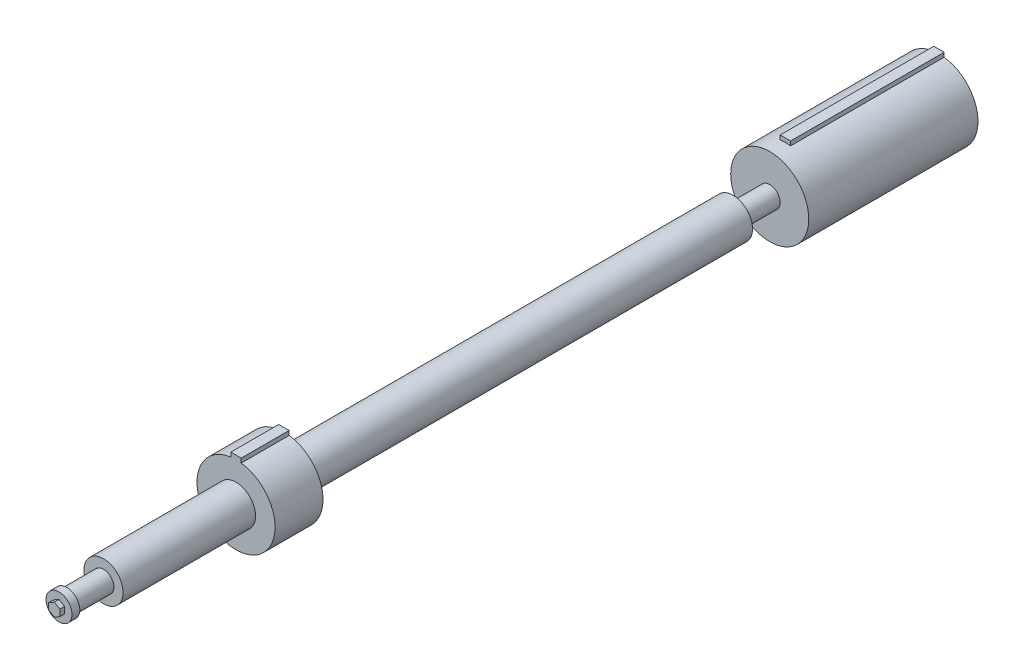
ISO-10303-21;
HEADER;
FILE_DESCRIPTION(('STEP AP214'),'2;1');
FILE_NAME('part.step','',(''),(''),'','','');
FILE_SCHEMA(('AUTOMOTIVE_DESIGN { 1 0 10303 214 1 1 1 1 }'));
ENDSEC;
DATA;
#1=APPLICATION_CONTEXT('core data for automotive mechanical design processes');
#2=APPLICATION_PROTOCOL_DEFINITION('international standard','automotive_design',2000,#1);
#3=PRODUCT_CONTEXT('',#1,'mechanical');
#4=PRODUCT('Part','Part','',(#3));
#5=PRODUCT_RELATED_PRODUCT_CATEGORY('part','',(#4));
#6=PRODUCT_DEFINITION_FORMATION('','',#4);
#7=PRODUCT_DEFINITION_CONTEXT('part definition',#1,'design');
#8=PRODUCT_DEFINITION('design','',#6,#7);
#9=PRODUCT_DEFINITION_SHAPE('','',#8);
#10=(LENGTH_UNIT() NAMED_UNIT(*) SI_UNIT(.MILLI.,.METRE.));
#11=(NAMED_UNIT(*) PLANE_ANGLE_UNIT() SI_UNIT($,.RADIAN.));
#12=(NAMED_UNIT(*) SI_UNIT($,.STERADIAN.) SOLID_ANGLE_UNIT());
#13=UNCERTAINTY_MEASURE_WITH_UNIT(LENGTH_MEASURE(1.E-05),#10,'distance_accuracy_value','');
#14=(GEOMETRIC_REPRESENTATION_CONTEXT(3) GLOBAL_UNCERTAINTY_ASSIGNED_CONTEXT((#13)) GLOBAL_UNIT_ASSIGNED_CONTEXT((#10,
#11,#12)) REPRESENTATION_CONTEXT('',''));
#15=CARTESIAN_POINT('',(0.,0.,0.));
#16=DIRECTION('',(0.,0.,1.));
#17=DIRECTION('',(1.,0.,0.));
#18=AXIS2_PLACEMENT_3D('',#15,#16,#17);
#19=CARTESIAN_POINT('',(0.,0.,120.9));
#20=DIRECTION('',(0.,0.,-1.));
#21=DIRECTION('',(-1.,0.,0.));
#22=AXIS2_PLACEMENT_3D('',#19,#20,#21);
#23=CYLINDRICAL_SURFACE('',#22,7.5);
#24=CARTESIAN_POINT('',(0.,0.,120.9));
#25=DIRECTION('',(0.,0.,1.));
#26=DIRECTION('',(1.,0.,0.));
#27=AXIS2_PLACEMENT_3D('',#24,#25,#26);
#28=CIRCLE('',#27,7.5);
#29=CARTESIAN_POINT('',(7.5,0.,120.9));
#30=VERTEX_POINT('',#29);
#31=EDGE_CURVE('E213',#30,#30,#28,.T.);
#32=ORIENTED_EDGE('',*,*,#31,.F.);
#33=EDGE_LOOP('',(#32));
#34=FACE_BOUND('',#33,.T.);
#35=CARTESIAN_POINT('',(0.,0.,70.));
#36=DIRECTION('',(0.,0.,-1.));
#37=DIRECTION('',(-1.,0.,0.));
#38=AXIS2_PLACEMENT_3D('',#35,#36,#37);
#39=CIRCLE('',#38,7.5);
#40=CARTESIAN_POINT('',(-7.5,0.,70.));
#41=VERTEX_POINT('',#40);
#42=EDGE_CURVE('E11',#41,#41,#39,.T.);
#43=ORIENTED_EDGE('',*,*,#42,.F.);
#44=EDGE_LOOP('',(#43));
#45=FACE_BOUND('',#44,.T.);
#46=ADVANCED_FACE('F35',(#34,#45),#23,.T.);
#47=CARTESIAN_POINT('',(0.,0.,135.));
#48=DIRECTION('',(0.,0.,-1.));
#49=DIRECTION('',(-1.,0.,0.));
#50=AXIS2_PLACEMENT_3D('',#47,#48,#49);
#51=CYLINDRICAL_SURFACE('',#50,4.);
#52=CARTESIAN_POINT('',(0.,0.,120.9));
#53=DIRECTION('',(0.,0.,1.));
#54=DIRECTION('',(1.,0.,0.));
#55=AXIS2_PLACEMENT_3D('',#52,#53,#54);
#56=CIRCLE('',#55,4.);
#57=CARTESIAN_POINT('',(4.,0.,120.9));
#58=VERTEX_POINT('',#57);
#59=EDGE_CURVE('E216',#58,#58,#56,.T.);
#60=ORIENTED_EDGE('',*,*,#59,.T.);
#61=EDGE_LOOP('',(#60));
#62=FACE_BOUND('',#61,.T.);
#63=CARTESIAN_POINT('',(0.,0.,135.));
#64=DIRECTION('',(0.,0.,1.));
#65=DIRECTION('',(1.,0.,0.));
#66=AXIS2_PLACEMENT_3D('',#63,#64,#65);
#67=CIRCLE('',#66,4.);
#68=CARTESIAN_POINT('',(4.,0.,135.));
#69=VERTEX_POINT('',#68);
#70=EDGE_CURVE('E272',#69,#69,#67,.T.);
#71=ORIENTED_EDGE('',*,*,#70,.F.);
#72=EDGE_LOOP('',(#71));
#73=FACE_BOUND('',#72,.T.);
#74=ADVANCED_FACE('F37',(#62,#73),#51,.T.);
#75=CARTESIAN_POINT('',(0.,0.,138.));
#76=DIRECTION('',(0.,0.,-1.));
#77=DIRECTION('',(-1.,0.,0.));
#78=AXIS2_PLACEMENT_3D('',#75,#76,#77);
#79=CYLINDRICAL_SURFACE('',#78,5.);
#80=CARTESIAN_POINT('',(0.,0.,138.));
#81=DIRECTION('',(0.,0.,1.));
#82=DIRECTION('',(1.,0.,0.));
#83=AXIS2_PLACEMENT_3D('',#80,#81,#82);
#84=CIRCLE('',#83,5.);
#85=CARTESIAN_POINT('',(5.,0.,138.));
#86=VERTEX_POINT('',#85);
#87=EDGE_CURVE('E269',#86,#86,#84,.T.);
#88=ORIENTED_EDGE('',*,*,#87,.F.);
#89=EDGE_LOOP('',(#88));
#90=FACE_BOUND('',#89,.T.);
#91=CARTESIAN_POINT('',(0.,0.,135.));
#92=DIRECTION('',(0.,0.,1.));
#93=DIRECTION('',(1.,0.,0.));
#94=AXIS2_PLACEMENT_3D('',#91,#92,#93);
#95=CIRCLE('',#94,5.);
#96=CARTESIAN_POINT('',(5.,0.,135.));
#97=VERTEX_POINT('',#96);
#98=EDGE_CURVE('E268',#97,#97,#95,.T.);
#99=ORIENTED_EDGE('',*,*,#98,.T.);
#100=EDGE_LOOP('',(#99));
#101=FACE_BOUND('',#100,.T.);
#102=ADVANCED_FACE('F357',(#90,#101),#79,.T.);
#103=CARTESIAN_POINT('',(0.,0.,138.));
#104=DIRECTION('',(0.,0.,1.));
#105=DIRECTION('',(1.,0.,0.));
#106=AXIS2_PLACEMENT_3D('',#103,#104,#105);
#107=PLANE('',#106);
#108=DIRECTION('',(-0.866025403784441,0.499999999999995,0.));
#109=VECTOR('',#108,1.);
#110=CARTESIAN_POINT('',(2.16506350946108,1.25000000000002,138.));
#111=LINE('',#110,#109);
#112=CARTESIAN_POINT('',(2.16506350946108,1.25000000000002,138.));
#113=VERTEX_POINT('',#112);
#114=CARTESIAN_POINT('',(0.,2.5,138.));
#115=VERTEX_POINT('',#114);
#116=EDGE_CURVE('E234',#113,#115,#111,.T.);
#117=ORIENTED_EDGE('',*,*,#116,.F.);
#118=DIRECTION('',(0.,1.,0.));
#119=VECTOR('',#118,1.);
#120=CARTESIAN_POINT('',(2.16506350946111,-1.24999999999998,138.));
#121=LINE('',#120,#119);
#122=CARTESIAN_POINT('',(2.16506350946111,-1.24999999999998,138.));
#123=VERTEX_POINT('',#122);
#124=EDGE_CURVE('E223',#123,#113,#121,.T.);
#125=ORIENTED_EDGE('',*,*,#124,.F.);
#126=DIRECTION('',(0.866025403784434,0.500000000000007,0.));
#127=VECTOR('',#126,1.);
#128=CARTESIAN_POINT('',(0.,-2.5,138.));
#129=LINE('',#128,#127);
#130=CARTESIAN_POINT('',(0.,-2.5,138.));
#131=VERTEX_POINT('',#130);
#132=EDGE_CURVE('E246',#131,#123,#129,.T.);
#133=ORIENTED_EDGE('',*,*,#132,.F.);
#134=DIRECTION('',(0.866025403784442,-0.499999999999995,0.));
#135=VECTOR('',#134,1.);
#136=CARTESIAN_POINT('',(-2.16506350946109,-1.25000000000001,138.));
#137=LINE('',#136,#135);
#138=CARTESIAN_POINT('',(-2.16506350946109,-1.25000000000001,138.));
#139=VERTEX_POINT('',#138);
#140=EDGE_CURVE('E243',#139,#131,#137,.T.);
#141=ORIENTED_EDGE('',*,*,#140,.F.);
#142=DIRECTION('',(0.,-1.,0.));
#143=VECTOR('',#142,1.);
#144=CARTESIAN_POINT('',(-2.1650635094611,1.24999999999999,138.));
#145=LINE('',#144,#143);
#146=CARTESIAN_POINT('',(-2.1650635094611,1.24999999999999,138.));
#147=VERTEX_POINT('',#146);
#148=EDGE_CURVE('E240',#147,#139,#145,.T.);
#149=ORIENTED_EDGE('',*,*,#148,.F.);
#150=DIRECTION('',(-0.866025403784438,-0.500000000000001,0.));
#151=VECTOR('',#150,1.);
#152=CARTESIAN_POINT('',(0.,2.5,138.));
#153=LINE('',#152,#151);
#154=EDGE_CURVE('E237',#115,#147,#153,.T.);
#155=ORIENTED_EDGE('',*,*,#154,.F.);
#156=EDGE_LOOP('',(#117,#125,#133,#141,#149,#155));
#157=FACE_BOUND('',#156,.T.);
#158=ORIENTED_EDGE('',*,*,#87,.T.);
#159=EDGE_LOOP('',(#158));
#160=FACE_BOUND('',#159,.T.);
#161=ADVANCED_FACE('F354',(#157,#160),#107,.T.);
#162=CARTESIAN_POINT('',(0.,0.,135.));
#163=DIRECTION('',(0.,0.,1.));
#164=DIRECTION('',(1.,0.,0.));
#165=AXIS2_PLACEMENT_3D('',#162,#163,#164);
#166=PLANE('',#165);
#167=ORIENTED_EDGE('',*,*,#70,.T.);
#168=EDGE_LOOP('',(#167));
#169=FACE_BOUND('',#168,.T.);
#170=ORIENTED_EDGE('',*,*,#98,.F.);
#171=EDGE_LOOP('',(#170));
#172=FACE_BOUND('',#171,.T.);
#173=ADVANCED_FACE('F352',(#169,#172),#166,.F.);
#174=CARTESIAN_POINT('',(2.16506350946108,1.25000000000002,139.8));
#175=DIRECTION('',(-0.499999999999995,-0.866025403784441,0.));
#176=DIRECTION('',(0.866025403784442,-0.499999999999995,0.));
#177=AXIS2_PLACEMENT_3D('',#174,#175,#176);
#178=PLANE('',#177);
#179=ORIENTED_EDGE('',*,*,#116,.T.);
#180=DIRECTION('',(0.,0.,-1.));
#181=VECTOR('',#180,1.);
#182=CARTESIAN_POINT('',(0.,2.5,139.8));
#183=LINE('',#182,#181);
#184=CARTESIAN_POINT('',(0.,2.5,139.8));
#185=VERTEX_POINT('',#184);
#186=EDGE_CURVE('E265',#185,#115,#183,.T.);
#187=ORIENTED_EDGE('',*,*,#186,.F.);
#188=DIRECTION('',(-0.866025403784441,0.499999999999995,0.));
#189=VECTOR('',#188,1.);
#190=CARTESIAN_POINT('',(2.16506350946108,1.25000000000002,139.8));
#191=LINE('',#190,#189);
#192=CARTESIAN_POINT('',(2.16506350946108,1.25000000000002,139.8));
#193=VERTEX_POINT('',#192);
#194=EDGE_CURVE('E219',#193,#185,#191,.T.);
#195=ORIENTED_EDGE('',*,*,#194,.F.);
#196=DIRECTION('',(0.,0.,-1.));
#197=VECTOR('',#196,1.);
#198=CARTESIAN_POINT('',(2.16506350946108,1.25000000000002,139.8));
#199=LINE('',#198,#197);
#200=EDGE_CURVE('E233',#193,#113,#199,.T.);
#201=ORIENTED_EDGE('',*,*,#200,.T.);
#202=EDGE_LOOP('',(#179,#187,#195,#201));
#203=FACE_BOUND('',#202,.T.);
#204=ADVANCED_FACE('F348',(#203),#178,.F.);
#205=CARTESIAN_POINT('',(0.,2.5,139.8));
#206=DIRECTION('',(0.500000000000001,-0.866025403784438,0.));
#207=DIRECTION('',(0.866025403784438,0.500000000000001,0.));
#208=AXIS2_PLACEMENT_3D('',#205,#206,#207);
#209=PLANE('',#208);
#210=ORIENTED_EDGE('',*,*,#154,.T.);
#211=DIRECTION('',(0.,0.,-1.));
#212=VECTOR('',#211,1.);
#213=CARTESIAN_POINT('',(-2.1650635094611,1.24999999999999,139.8));
#214=LINE('',#213,#212);
#215=CARTESIAN_POINT('',(-2.1650635094611,1.24999999999999,139.8));
#216=VERTEX_POINT('',#215);
#217=EDGE_CURVE('E262',#216,#147,#214,.T.);
#218=ORIENTED_EDGE('',*,*,#217,.F.);
#219=DIRECTION('',(-0.866025403784438,-0.500000000000001,0.));
#220=VECTOR('',#219,1.);
#221=CARTESIAN_POINT('',(0.,2.5,139.8));
#222=LINE('',#221,#220);
#223=EDGE_CURVE('E222',#185,#216,#222,.T.);
#224=ORIENTED_EDGE('',*,*,#223,.F.);
#225=ORIENTED_EDGE('',*,*,#186,.T.);
#226=EDGE_LOOP('',(#210,#218,#224,#225));
#227=FACE_BOUND('',#226,.T.);
#228=ADVANCED_FACE('F344',(#227),#209,.F.);
#229=CARTESIAN_POINT('',(-2.1650635094611,1.24999999999999,139.8));
#230=DIRECTION('',(1.,0.,0.));
#231=DIRECTION('',(0.,1.,0.));
#232=AXIS2_PLACEMENT_3D('',#229,#230,#231);
#233=PLANE('',#232);
#234=ORIENTED_EDGE('',*,*,#148,.T.);
#235=DIRECTION('',(0.,0.,-1.));
#236=VECTOR('',#235,1.);
#237=CARTESIAN_POINT('',(-2.16506350946109,-1.25000000000001,139.8));
#238=LINE('',#237,#236);
#239=CARTESIAN_POINT('',(-2.16506350946109,-1.25000000000001,139.8));
#240=VERTEX_POINT('',#239);
#241=EDGE_CURVE('E259',#240,#139,#238,.T.);
#242=ORIENTED_EDGE('',*,*,#241,.F.);
#243=DIRECTION('',(0.,-1.,0.));
#244=VECTOR('',#243,1.);
#245=CARTESIAN_POINT('',(-2.1650635094611,1.24999999999999,139.8));
#246=LINE('',#245,#244);
#247=EDGE_CURVE('E225',#216,#240,#246,.T.);
#248=ORIENTED_EDGE('',*,*,#247,.F.);
#249=ORIENTED_EDGE('',*,*,#217,.T.);
#250=EDGE_LOOP('',(#234,#242,#248,#249));
#251=FACE_BOUND('',#250,.T.);
#252=ADVANCED_FACE('F340',(#251),#233,.F.);
#253=CARTESIAN_POINT('',(-2.16506350946109,-1.25000000000001,139.8));
#254=DIRECTION('',(0.499999999999995,0.866025403784442,0.));
#255=DIRECTION('',(-0.866025403784442,0.499999999999995,0.));
#256=AXIS2_PLACEMENT_3D('',#253,#254,#255);
#257=PLANE('',#256);
#258=ORIENTED_EDGE('',*,*,#140,.T.);
#259=DIRECTION('',(0.,0.,-1.));
#260=VECTOR('',#259,1.);
#261=CARTESIAN_POINT('',(0.,-2.5,139.8));
#262=LINE('',#261,#260);
#263=CARTESIAN_POINT('',(0.,-2.5,139.8));
#264=VERTEX_POINT('',#263);
#265=EDGE_CURVE('E256',#264,#131,#262,.T.);
#266=ORIENTED_EDGE('',*,*,#265,.F.);
#267=DIRECTION('',(0.866025403784442,-0.499999999999995,0.));
#268=VECTOR('',#267,1.);
#269=CARTESIAN_POINT('',(-2.16506350946109,-1.25000000000001,139.8));
#270=LINE('',#269,#268);
#271=EDGE_CURVE('E227',#240,#264,#270,.T.);
#272=ORIENTED_EDGE('',*,*,#271,.F.);
#273=ORIENTED_EDGE('',*,*,#241,.T.);
#274=EDGE_LOOP('',(#258,#266,#272,#273));
#275=FACE_BOUND('',#274,.T.);
#276=ADVANCED_FACE('F336',(#275),#257,.F.);
#277=CARTESIAN_POINT('',(0.,-2.5,139.8));
#278=DIRECTION('',(-0.500000000000007,0.866025403784435,0.));
#279=DIRECTION('',(-0.866025403784435,-0.500000000000007,0.));
#280=AXIS2_PLACEMENT_3D('',#277,#278,#279);
#281=PLANE('',#280);
#282=ORIENTED_EDGE('',*,*,#132,.T.);
#283=DIRECTION('',(0.,0.,-1.));
#284=VECTOR('',#283,1.);
#285=CARTESIAN_POINT('',(2.16506350946111,-1.24999999999998,139.8));
#286=LINE('',#285,#284);
#287=CARTESIAN_POINT('',(2.16506350946111,-1.24999999999998,139.8));
#288=VERTEX_POINT('',#287);
#289=EDGE_CURVE('E253',#288,#123,#286,.T.);
#290=ORIENTED_EDGE('',*,*,#289,.F.);
#291=DIRECTION('',(0.866025403784434,0.500000000000007,0.));
#292=VECTOR('',#291,1.);
#293=CARTESIAN_POINT('',(0.,-2.5,139.8));
#294=LINE('',#293,#292);
#295=EDGE_CURVE('E229',#264,#288,#294,.T.);
#296=ORIENTED_EDGE('',*,*,#295,.F.);
#297=ORIENTED_EDGE('',*,*,#265,.T.);
#298=EDGE_LOOP('',(#282,#290,#296,#297));
#299=FACE_BOUND('',#298,.T.);
#300=ADVANCED_FACE('F332',(#299),#281,.F.);
#301=CARTESIAN_POINT('',(2.16506350946111,-1.24999999999998,139.8));
#302=DIRECTION('',(-1.,0.,0.));
#303=DIRECTION('',(0.,-1.,0.));
#304=AXIS2_PLACEMENT_3D('',#301,#302,#303);
#305=PLANE('',#304);
#306=ORIENTED_EDGE('',*,*,#124,.T.);
#307=ORIENTED_EDGE('',*,*,#200,.F.);
#308=DIRECTION('',(0.,1.,0.));
#309=VECTOR('',#308,1.);
#310=CARTESIAN_POINT('',(2.16506350946111,-1.24999999999998,139.8));
#311=LINE('',#310,#309);
#312=EDGE_CURVE('E231',#288,#193,#311,.T.);
#313=ORIENTED_EDGE('',*,*,#312,.F.);
#314=ORIENTED_EDGE('',*,*,#289,.T.);
#315=EDGE_LOOP('',(#306,#307,#313,#314));
#316=FACE_BOUND('',#315,.T.);
#317=ADVANCED_FACE('F328',(#316),#305,.F.);
#318=CARTESIAN_POINT('',(0.,0.,139.8));
#319=DIRECTION('',(0.,0.,1.));
#320=DIRECTION('',(1.,0.,0.));
#321=AXIS2_PLACEMENT_3D('',#318,#319,#320);
#322=PLANE('',#321);
#323=ORIENTED_EDGE('',*,*,#194,.T.);
#324=ORIENTED_EDGE('',*,*,#223,.T.);
#325=ORIENTED_EDGE('',*,*,#247,.T.);
#326=ORIENTED_EDGE('',*,*,#271,.T.);
#327=ORIENTED_EDGE('',*,*,#295,.T.);
#328=ORIENTED_EDGE('',*,*,#312,.T.);
#329=EDGE_LOOP('',(#323,#324,#325,#326,#327,#328));
#330=FACE_BOUND('',#329,.T.);
#331=ADVANCED_FACE('F290',(#330),#322,.T.);
#332=CARTESIAN_POINT('',(0.,0.,120.9));
#333=DIRECTION('',(0.,0.,1.));
#334=DIRECTION('',(1.,0.,0.));
#335=AXIS2_PLACEMENT_3D('',#332,#333,#334);
#336=PLANE('',#335);
#337=ORIENTED_EDGE('',*,*,#59,.F.);
#338=EDGE_LOOP('',(#337));
#339=FACE_BOUND('',#338,.T.);
#340=ORIENTED_EDGE('',*,*,#31,.T.);
#341=EDGE_LOOP('',(#340));
#342=FACE_BOUND('',#341,.T.);
#343=ADVANCED_FACE('F286',(#339,#342),#336,.T.);
#344=CARTESIAN_POINT('',(0.,0.,55.));
#345=DIRECTION('',(0.,0.,1.));
#346=DIRECTION('',(1.,0.,0.));
#347=AXIS2_PLACEMENT_3D('',#344,#345,#346);
#348=CYLINDRICAL_SURFACE('',#347,15.);
#349=CARTESIAN_POINT('',(0.,0.,70.));
#350=DIRECTION('',(0.,0.,-1.));
#351=DIRECTION('',(-1.,0.,0.));
#352=AXIS2_PLACEMENT_3D('',#349,#350,#351);
#353=CIRCLE('',#352,15.);
#354=CARTESIAN_POINT('',(2.,14.8660687473185,70.));
#355=VERTEX_POINT('',#354);
#356=CARTESIAN_POINT('',(-2.,14.8660687473185,70.));
#357=VERTEX_POINT('',#356);
#358=EDGE_CURVE('E209',#355,#357,#353,.T.);
#359=ORIENTED_EDGE('',*,*,#358,.T.);
#360=DIRECTION('',(0.,0.,1.));
#361=VECTOR('',#360,1.);
#362=CARTESIAN_POINT('',(-2.,14.8660687473185,55.));
#363=LINE('',#362,#361);
#364=CARTESIAN_POINT('',(-2.,14.8660687473185,51.6));
#365=VERTEX_POINT('',#364);
#366=EDGE_CURVE('E207',#357,#365,#363,.F.);
#367=ORIENTED_EDGE('',*,*,#366,.T.);
#368=CARTESIAN_POINT('',(0.,0.,51.6));
#369=DIRECTION('',(0.,0.,-1.));
#370=DIRECTION('',(-1.,0.,0.));
#371=AXIS2_PLACEMENT_3D('',#368,#369,#370);
#372=CIRCLE('',#371,15.);
#373=CARTESIAN_POINT('',(2.,14.8660687473185,51.6));
#374=VERTEX_POINT('',#373);
#375=EDGE_CURVE('E182',#374,#365,#372,.T.);
#376=ORIENTED_EDGE('',*,*,#375,.F.);
#377=DIRECTION('',(0.,0.,1.));
#378=VECTOR('',#377,1.);
#379=CARTESIAN_POINT('',(2.,14.8660687473185,55.));
#380=LINE('',#379,#378);
#381=EDGE_CURVE('E205',#374,#355,#380,.T.);
#382=ORIENTED_EDGE('',*,*,#381,.T.);
#383=EDGE_LOOP('',(#359,#367,#376,#382));
#384=FACE_BOUND('',#383,.T.);
#385=ADVANCED_FACE('F289',(#384),#348,.T.);
#386=CARTESIAN_POINT('',(0.,0.,70.));
#387=DIRECTION('',(0.,0.,-1.));
#388=DIRECTION('',(-1.,0.,0.));
#389=AXIS2_PLACEMENT_3D('',#386,#387,#388);
#390=PLANE('',#389);
#391=ORIENTED_EDGE('',*,*,#358,.F.);
#392=DIRECTION('',(0.,1.,0.));
#393=VECTOR('',#392,1.);
#394=CARTESIAN_POINT('',(2.,13.5,70.));
#395=LINE('',#394,#393);
#396=CARTESIAN_POINT('',(2.,16.5,70.));
#397=VERTEX_POINT('',#396);
#398=EDGE_CURVE('E59',#355,#397,#395,.T.);
#399=ORIENTED_EDGE('',*,*,#398,.T.);
#400=DIRECTION('',(-1.,0.,0.));
#401=VECTOR('',#400,1.);
#402=CARTESIAN_POINT('',(-2.,16.5,70.));
#403=LINE('',#402,#401);
#404=CARTESIAN_POINT('',(-2.,16.5,70.));
#405=VERTEX_POINT('',#404);
#406=EDGE_CURVE('E198',#397,#405,#403,.T.);
#407=ORIENTED_EDGE('',*,*,#406,.T.);
#408=DIRECTION('',(0.,-1.,0.));
#409=VECTOR('',#408,1.);
#410=CARTESIAN_POINT('',(-2.,13.5,70.));
#411=LINE('',#410,#409);
#412=EDGE_CURVE('E194',#405,#357,#411,.T.);
#413=ORIENTED_EDGE('',*,*,#412,.T.);
#414=EDGE_LOOP('',(#391,#399,#407,#413));
#415=FACE_BOUND('',#414,.T.);
#416=ORIENTED_EDGE('',*,*,#42,.T.);
#417=EDGE_LOOP('',(#416));
#418=FACE_BOUND('',#417,.T.);
#419=ADVANCED_FACE('F300',(#415,#418),#390,.F.);
#420=CARTESIAN_POINT('',(-2.,13.5,50.));
#421=DIRECTION('',(-1.,0.,0.));
#422=DIRECTION('',(0.,0.,1.));
#423=AXIS2_PLACEMENT_3D('',#420,#421,#422);
#424=PLANE('',#423);
#425=ORIENTED_EDGE('',*,*,#366,.F.);
#426=ORIENTED_EDGE('',*,*,#412,.F.);
#427=DIRECTION('',(0.,0.,1.));
#428=VECTOR('',#427,1.);
#429=CARTESIAN_POINT('',(-2.,16.5,50.));
#430=LINE('',#429,#428);
#431=CARTESIAN_POINT('',(-2.,16.5,51.6));
#432=VERTEX_POINT('',#431);
#433=EDGE_CURVE('E197',#432,#405,#430,.T.);
#434=ORIENTED_EDGE('',*,*,#433,.F.);
#435=DIRECTION('',(0.,1.,0.));
#436=VECTOR('',#435,1.);
#437=CARTESIAN_POINT('',(-2.,14.8660687473185,51.6));
#438=LINE('',#437,#436);
#439=EDGE_CURVE('E185',#365,#432,#438,.T.);
#440=ORIENTED_EDGE('',*,*,#439,.F.);
#441=EDGE_LOOP('',(#425,#426,#434,#440));
#442=FACE_BOUND('',#441,.T.);
#443=ADVANCED_FACE('F302',(#442),#424,.T.);
#444=CARTESIAN_POINT('',(2.,13.5,50.));
#445=DIRECTION('',(1.,0.,0.));
#446=DIRECTION('',(0.,0.,-1.));
#447=AXIS2_PLACEMENT_3D('',#444,#445,#446);
#448=PLANE('',#447);
#449=ORIENTED_EDGE('',*,*,#381,.F.);
#450=DIRECTION('',(0.,-1.,0.));
#451=VECTOR('',#450,1.);
#452=CARTESIAN_POINT('',(2.,16.5,51.6));
#453=LINE('',#452,#451);
#454=CARTESIAN_POINT('',(2.,16.5,51.6));
#455=VERTEX_POINT('',#454);
#456=EDGE_CURVE('E191',#455,#374,#453,.T.);
#457=ORIENTED_EDGE('',*,*,#456,.F.);
#458=DIRECTION('',(0.,0.,1.));
#459=VECTOR('',#458,1.);
#460=CARTESIAN_POINT('',(2.,16.5,50.));
#461=LINE('',#460,#459);
#462=EDGE_CURVE('E203',#455,#397,#461,.T.);
#463=ORIENTED_EDGE('',*,*,#462,.T.);
#464=ORIENTED_EDGE('',*,*,#398,.F.);
#465=EDGE_LOOP('',(#449,#457,#463,#464));
#466=FACE_BOUND('',#465,.T.);
#467=ADVANCED_FACE('F310',(#466),#448,.T.);
#468=CARTESIAN_POINT('',(-2.,16.5,50.));
#469=DIRECTION('',(0.,1.,0.));
#470=DIRECTION('',(0.,0.,1.));
#471=AXIS2_PLACEMENT_3D('',#468,#469,#470);
#472=PLANE('',#471);
#473=ORIENTED_EDGE('',*,*,#462,.F.);
#474=DIRECTION('',(1.,0.,0.));
#475=VECTOR('',#474,1.);
#476=CARTESIAN_POINT('',(-2.,16.5,51.6));
#477=LINE('',#476,#475);
#478=EDGE_CURVE('E188',#432,#455,#477,.T.);
#479=ORIENTED_EDGE('',*,*,#478,.F.);
#480=ORIENTED_EDGE('',*,*,#433,.T.);
#481=ORIENTED_EDGE('',*,*,#406,.F.);
#482=EDGE_LOOP('',(#473,#479,#480,#481));
#483=FACE_BOUND('',#482,.T.);
#484=ADVANCED_FACE('F317',(#483),#472,.T.);
#485=CARTESIAN_POINT('',(0.,0.,51.6));
#486=DIRECTION('',(0.,0.,-1.));
#487=DIRECTION('',(-1.,0.,0.));
#488=AXIS2_PLACEMENT_3D('',#485,#486,#487);
#489=PLANE('',#488);
#490=CARTESIAN_POINT('',(0.,0.,51.6));
#491=DIRECTION('',(0.,0.,-1.));
#492=DIRECTION('',(-1.,0.,0.));
#493=AXIS2_PLACEMENT_3D('',#490,#491,#492);
#494=CIRCLE('',#493,7.5);
#495=CARTESIAN_POINT('',(-7.5,0.,51.6));
#496=VERTEX_POINT('',#495);
#497=EDGE_CURVE('E39',#496,#496,#494,.T.);
#498=ORIENTED_EDGE('',*,*,#497,.F.);
#499=EDGE_LOOP('',(#498));
#500=FACE_BOUND('',#499,.T.);
#501=ORIENTED_EDGE('',*,*,#375,.T.);
#502=ORIENTED_EDGE('',*,*,#439,.T.);
#503=ORIENTED_EDGE('',*,*,#478,.T.);
#504=ORIENTED_EDGE('',*,*,#456,.T.);
#505=EDGE_LOOP('',(#501,#502,#503,#504));
#506=FACE_BOUND('',#505,.T.);
#507=ADVANCED_FACE('F376',(#500,#506),#489,.T.);
#508=CARTESIAN_POINT('',(0.,0.,-135.));
#509=DIRECTION('',(0.,0.,1.));
#510=DIRECTION('',(1.,0.,0.));
#511=AXIS2_PLACEMENT_3D('',#508,#509,#510);
#512=CIRCLE('',#511,4.);
#513=CARTESIAN_POINT('',(4.,0.,-135.));
#514=VERTEX_POINT('',#513);
#515=EDGE_CURVE('E179',#514,#514,#512,.T.);
#516=ORIENTED_EDGE('',*,*,#515,.T.);
#517=EDGE_LOOP('',(#516));
#518=FACE_BOUND('',#517,.T.);
#519=CARTESIAN_POINT('',(0.,0.,-120.9));
#520=DIRECTION('',(0.,0.,1.));
#521=DIRECTION('',(1.,0.,0.));
#522=AXIS2_PLACEMENT_3D('',#519,#520,#521);
#523=CIRCLE('',#522,4.);
#524=CARTESIAN_POINT('',(4.,0.,-120.9));
#525=VERTEX_POINT('',#524);
#526=EDGE_CURVE('E44',#525,#525,#523,.T.);
#527=ORIENTED_EDGE('',*,*,#526,.F.);
#528=EDGE_LOOP('',(#527));
#529=FACE_BOUND('',#528,.T.);
#530=ADVANCED_FACE('F321',(#518,#529),#51,.T.);
#531=CARTESIAN_POINT('',(0.,0.,-120.9));
#532=DIRECTION('',(0.,0.,1.));
#533=DIRECTION('',(1.,0.,0.));
#534=AXIS2_PLACEMENT_3D('',#531,#532,#533);
#535=PLANE('',#534);
#536=ORIENTED_EDGE('',*,*,#526,.T.);
#537=EDGE_LOOP('',(#536));
#538=FACE_BOUND('',#537,.T.);
#539=CARTESIAN_POINT('',(0.,0.,-120.9));
#540=DIRECTION('',(0.,0.,1.));
#541=DIRECTION('',(1.,0.,0.));
#542=AXIS2_PLACEMENT_3D('',#539,#540,#541);
#543=CIRCLE('',#542,7.5);
#544=CARTESIAN_POINT('',(7.5,0.,-120.9));
#545=VERTEX_POINT('',#544);
#546=EDGE_CURVE('E212',#545,#545,#543,.T.);
#547=ORIENTED_EDGE('',*,*,#546,.F.);
#548=EDGE_LOOP('',(#547));
#549=FACE_BOUND('',#548,.T.);
#550=ADVANCED_FACE('F319',(#538,#549),#535,.F.);
#551=ORIENTED_EDGE('',*,*,#497,.T.);
#552=EDGE_LOOP('',(#551));
#553=FACE_BOUND('',#552,.T.);
#554=ORIENTED_EDGE('',*,*,#546,.T.);
#555=EDGE_LOOP('',(#554));
#556=FACE_BOUND('',#555,.T.);
#557=ADVANCED_FACE('F297',(#553,#556),#23,.T.);
#558=CARTESIAN_POINT('',(0.,0.,-141.));
#559=DIRECTION('',(0.,0.,1.));
#560=DIRECTION('',(1.,0.,0.));
#561=AXIS2_PLACEMENT_3D('',#558,#559,#560);
#562=CYLINDRICAL_SURFACE('',#561,15.);
#563=CARTESIAN_POINT('',(0.,0.,-141.));
#564=DIRECTION('',(0.,0.,-1.));
#565=DIRECTION('',(-1.,0.,0.));
#566=AXIS2_PLACEMENT_3D('',#563,#564,#565);
#567=CIRCLE('',#566,15.);
#568=CARTESIAN_POINT('',(-2.,14.8660687473185,-141.));
#569=VERTEX_POINT('',#568);
#570=CARTESIAN_POINT('',(2.,14.8660687473185,-141.));
#571=VERTEX_POINT('',#570);
#572=EDGE_CURVE('E51',#569,#571,#567,.T.);
#573=ORIENTED_EDGE('',*,*,#572,.F.);
#574=DIRECTION('',(0.,0.,1.));
#575=VECTOR('',#574,1.);
#576=CARTESIAN_POINT('',(-2.,14.8660687473185,-151.));
#577=LINE('',#576,#575);
#578=CARTESIAN_POINT('',(-2.,14.8660687473185,-200.));
#579=VERTEX_POINT('',#578);
#580=EDGE_CURVE('E152',#579,#569,#577,.T.);
#581=ORIENTED_EDGE('',*,*,#580,.F.);
#582=CARTESIAN_POINT('',(0.,0.,-200.));
#583=DIRECTION('',(0.,0.,-1.));
#584=DIRECTION('',(-1.,0.,0.));
#585=AXIS2_PLACEMENT_3D('',#582,#583,#584);
#586=CIRCLE('',#585,15.);
#587=CARTESIAN_POINT('',(2.,14.8660687473185,-200.));
#588=VERTEX_POINT('',#587);
#589=EDGE_CURVE('E148',#588,#579,#586,.T.);
#590=ORIENTED_EDGE('',*,*,#589,.F.);
#591=DIRECTION('',(0.,0.,1.));
#592=VECTOR('',#591,1.);
#593=CARTESIAN_POINT('',(2.,14.8660687473185,-151.));
#594=LINE('',#593,#592);
#595=EDGE_CURVE('E138',#588,#571,#594,.T.);
#596=ORIENTED_EDGE('',*,*,#595,.T.);
#597=EDGE_LOOP('',(#573,#581,#590,#596));
#598=FACE_BOUND('',#597,.T.);
#599=CARTESIAN_POINT('',(0.,0.,-135.));
#600=DIRECTION('',(0.,0.,-1.));
#601=DIRECTION('',(-1.,0.,0.));
#602=AXIS2_PLACEMENT_3D('',#599,#600,#601);
#603=CIRCLE('',#602,15.);
#604=CARTESIAN_POINT('',(-15.,0.,-135.));
#605=VERTEX_POINT('',#604);
#606=EDGE_CURVE('E177',#605,#605,#603,.T.);
#607=ORIENTED_EDGE('',*,*,#606,.T.);
#608=EDGE_LOOP('',(#607));
#609=FACE_BOUND('',#608,.T.);
#610=ADVANCED_FACE('F149',(#598,#609),#562,.T.);
#611=CARTESIAN_POINT('',(0.,0.,-135.));
#612=DIRECTION('',(0.,0.,-1.));
#613=DIRECTION('',(-1.,0.,0.));
#614=AXIS2_PLACEMENT_3D('',#611,#612,#613);
#615=PLANE('',#614);
#616=ORIENTED_EDGE('',*,*,#515,.F.);
#617=EDGE_LOOP('',(#616));
#618=FACE_BOUND('',#617,.T.);
#619=ORIENTED_EDGE('',*,*,#606,.F.);
#620=EDGE_LOOP('',(#619));
#621=FACE_BOUND('',#620,.T.);
#622=ADVANCED_FACE('F391',(#618,#621),#615,.F.);
#623=CARTESIAN_POINT('',(0.,0.,-141.));
#624=DIRECTION('',(0.,0.,-1.));
#625=DIRECTION('',(-1.,0.,0.));
#626=AXIS2_PLACEMENT_3D('',#623,#624,#625);
#627=PLANE('',#626);
#628=DIRECTION('',(0.,1.,0.));
#629=VECTOR('',#628,1.);
#630=CARTESIAN_POINT('',(-2.,0.,-141.));
#631=LINE('',#630,#629);
#632=CARTESIAN_POINT('',(-2.,16.5,-141.));
#633=VERTEX_POINT('',#632);
#634=EDGE_CURVE('E166',#569,#633,#631,.T.);
#635=ORIENTED_EDGE('',*,*,#634,.F.);
#636=ORIENTED_EDGE('',*,*,#572,.T.);
#637=DIRECTION('',(0.,1.,0.));
#638=VECTOR('',#637,1.);
#639=CARTESIAN_POINT('',(2.,0.,-141.));
#640=LINE('',#639,#638);
#641=CARTESIAN_POINT('',(2.,16.5,-141.));
#642=VERTEX_POINT('',#641);
#643=EDGE_CURVE('E143',#571,#642,#640,.T.);
#644=ORIENTED_EDGE('',*,*,#643,.T.);
#645=DIRECTION('',(-1.,0.,0.));
#646=VECTOR('',#645,1.);
#647=CARTESIAN_POINT('',(0.,16.5,-141.));
#648=LINE('',#647,#646);
#649=EDGE_CURVE('E169',#642,#633,#648,.T.);
#650=ORIENTED_EDGE('',*,*,#649,.T.);
#651=EDGE_LOOP('',(#635,#636,#644,#650));
#652=FACE_BOUND('',#651,.T.);
#653=ADVANCED_FACE('F394',(#652),#627,.F.);
#654=CARTESIAN_POINT('',(-2.,0.,-151.));
#655=DIRECTION('',(1.,0.,0.));
#656=DIRECTION('',(0.,0.,-1.));
#657=AXIS2_PLACEMENT_3D('',#654,#655,#656);
#658=PLANE('',#657);
#659=ORIENTED_EDGE('',*,*,#634,.T.);
#660=DIRECTION('',(0.,0.,1.));
#661=VECTOR('',#660,1.);
#662=CARTESIAN_POINT('',(-2.,16.5,-151.));
#663=LINE('',#662,#661);
#664=CARTESIAN_POINT('',(-2.,16.5,-200.));
#665=VERTEX_POINT('',#664);
#666=EDGE_CURVE('E174',#665,#633,#663,.T.);
#667=ORIENTED_EDGE('',*,*,#666,.F.);
#668=DIRECTION('',(0.,1.,0.));
#669=VECTOR('',#668,1.);
#670=CARTESIAN_POINT('',(-2.,14.8660687473185,-200.));
#671=LINE('',#670,#669);
#672=EDGE_CURVE('E156',#579,#665,#671,.T.);
#673=ORIENTED_EDGE('',*,*,#672,.F.);
#674=ORIENTED_EDGE('',*,*,#580,.T.);
#675=EDGE_LOOP('',(#659,#667,#673,#674));
#676=FACE_BOUND('',#675,.T.);
#677=ADVANCED_FACE('F431',(#676),#658,.F.);
#678=CARTESIAN_POINT('',(0.,16.5,-151.));
#679=DIRECTION('',(0.,1.,0.));
#680=DIRECTION('',(0.,0.,1.));
#681=AXIS2_PLACEMENT_3D('',#678,#679,#680);
#682=PLANE('',#681);
#683=ORIENTED_EDGE('',*,*,#649,.F.);
#684=DIRECTION('',(0.,0.,1.));
#685=VECTOR('',#684,1.);
#686=CARTESIAN_POINT('',(2.,16.5,-151.));
#687=LINE('',#686,#685);
#688=CARTESIAN_POINT('',(2.,16.5,-200.));
#689=VERTEX_POINT('',#688);
#690=EDGE_CURVE('E145',#689,#642,#687,.T.);
#691=ORIENTED_EDGE('',*,*,#690,.F.);
#692=DIRECTION('',(1.,0.,0.));
#693=VECTOR('',#692,1.);
#694=CARTESIAN_POINT('',(-2.,16.5,-200.));
#695=LINE('',#694,#693);
#696=EDGE_CURVE('E161',#665,#689,#695,.T.);
#697=ORIENTED_EDGE('',*,*,#696,.F.);
#698=ORIENTED_EDGE('',*,*,#666,.T.);
#699=EDGE_LOOP('',(#683,#691,#697,#698));
#700=FACE_BOUND('',#699,.T.);
#701=ADVANCED_FACE('F449',(#700),#682,.T.);
#702=CARTESIAN_POINT('',(2.,0.,-151.));
#703=DIRECTION('',(1.,0.,0.));
#704=DIRECTION('',(0.,0.,-1.));
#705=AXIS2_PLACEMENT_3D('',#702,#703,#704);
#706=PLANE('',#705);
#707=ORIENTED_EDGE('',*,*,#643,.F.);
#708=ORIENTED_EDGE('',*,*,#595,.F.);
#709=DIRECTION('',(0.,-1.,0.));
#710=VECTOR('',#709,1.);
#711=CARTESIAN_POINT('',(2.,16.5,-200.));
#712=LINE('',#711,#710);
#713=EDGE_CURVE('E142',#689,#588,#712,.T.);
#714=ORIENTED_EDGE('',*,*,#713,.F.);
#715=ORIENTED_EDGE('',*,*,#690,.T.);
#716=EDGE_LOOP('',(#707,#708,#714,#715));
#717=FACE_BOUND('',#716,.T.);
#718=ADVANCED_FACE('F140',(#717),#706,.T.);
#719=CARTESIAN_POINT('',(0.,0.,-200.));
#720=DIRECTION('',(0.,0.,-1.));
#721=DIRECTION('',(-1.,0.,0.));
#722=AXIS2_PLACEMENT_3D('',#719,#720,#721);
#723=PLANE('',#722);
#724=ORIENTED_EDGE('',*,*,#713,.T.);
#725=ORIENTED_EDGE('',*,*,#589,.T.);
#726=ORIENTED_EDGE('',*,*,#672,.T.);
#727=ORIENTED_EDGE('',*,*,#696,.T.);
#728=EDGE_LOOP('',(#724,#725,#726,#727));
#729=FACE_BOUND('',#728,.T.);
#730=ADVANCED_FACE('F159',(#729),#723,.T.);
#731=CLOSED_SHELL('',(#46,#74,#102,#161,#173,#204,#228,#252,#276,#300,#317,#331,#343,#385,#419,
#443,#467,#484,#507,#530,#550,#557,#610,#622,#653,#677,#701,#718,#730));
#732=MANIFOLD_SOLID_BREP('B2',#731);
#733=ADVANCED_BREP_SHAPE_REPRESENTATION('',(#18,#732),#14);
#734=SHAPE_DEFINITION_REPRESENTATION(#9,#733);
ENDSEC;
END-ISO-10303-21;
